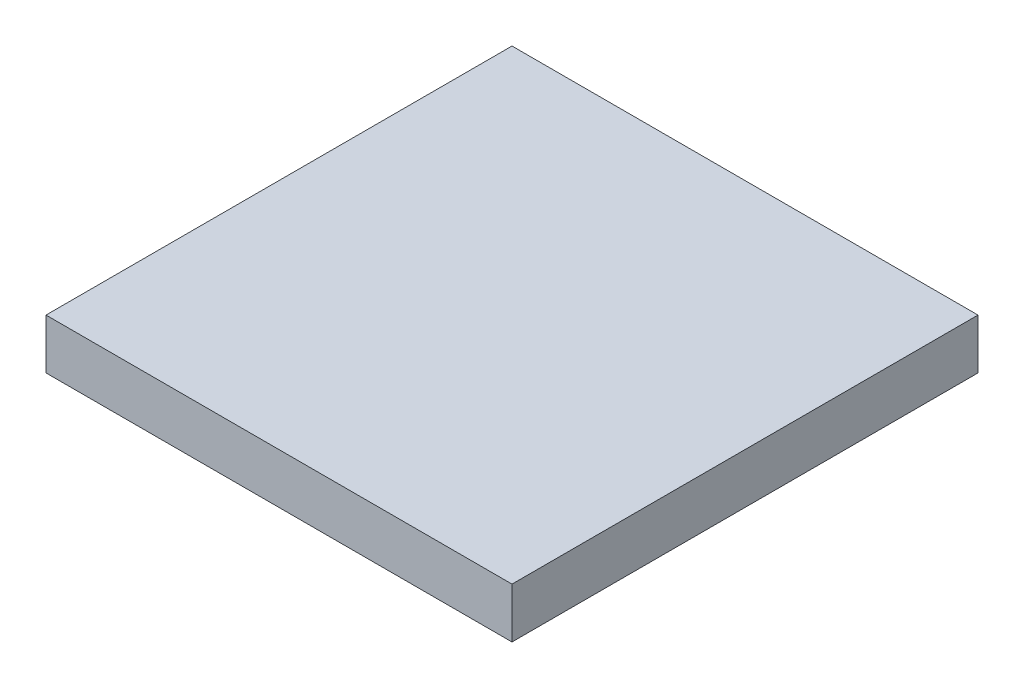
ISO-10303-21;
HEADER;
FILE_DESCRIPTION(('STEP AP214'),'2;1');
FILE_NAME('part.step','',(''),(''),'','','');
FILE_SCHEMA(('AUTOMOTIVE_DESIGN { 1 0 10303 214 1 1 1 1 }'));
ENDSEC;
DATA;
#1=APPLICATION_CONTEXT('core data for automotive mechanical design processes');
#2=APPLICATION_PROTOCOL_DEFINITION('international standard','automotive_design',2000,#1);
#3=PRODUCT_CONTEXT('',#1,'mechanical');
#4=PRODUCT('Part','Part','',(#3));
#5=PRODUCT_RELATED_PRODUCT_CATEGORY('part','',(#4));
#6=PRODUCT_DEFINITION_FORMATION('','',#4);
#7=PRODUCT_DEFINITION_CONTEXT('part definition',#1,'design');
#8=PRODUCT_DEFINITION('design','',#6,#7);
#9=PRODUCT_DEFINITION_SHAPE('','',#8);
#10=(LENGTH_UNIT() NAMED_UNIT(*) SI_UNIT(.MILLI.,.METRE.));
#11=(NAMED_UNIT(*) PLANE_ANGLE_UNIT() SI_UNIT($,.RADIAN.));
#12=(NAMED_UNIT(*) SI_UNIT($,.STERADIAN.) SOLID_ANGLE_UNIT());
#13=UNCERTAINTY_MEASURE_WITH_UNIT(LENGTH_MEASURE(1.E-05),#10,'distance_accuracy_value','');
#14=(GEOMETRIC_REPRESENTATION_CONTEXT(3) GLOBAL_UNCERTAINTY_ASSIGNED_CONTEXT((#13)) GLOBAL_UNIT_ASSIGNED_CONTEXT((#10,
#11,#12)) REPRESENTATION_CONTEXT('',''));
#15=CARTESIAN_POINT('',(0.,0.,0.));
#16=DIRECTION('',(0.,0.,1.));
#17=DIRECTION('',(1.,0.,0.));
#18=AXIS2_PLACEMENT_3D('',#15,#16,#17);
#19=CARTESIAN_POINT('',(0.,0.,0.));
#20=DIRECTION('',(0.,-1.,0.));
#21=DIRECTION('',(0.,0.,-1.));
#22=AXIS2_PLACEMENT_3D('',#19,#20,#21);
#23=PLANE('',#22);
#24=DIRECTION('',(-1.,0.,0.));
#25=VECTOR('',#24,1.);
#26=CARTESIAN_POINT('',(-2.,0.,-8.08041562219304));
#27=LINE('',#26,#25);
#28=CARTESIAN_POINT('',(156.,0.,-8.08041562219304));
#29=VERTEX_POINT('',#28);
#30=CARTESIAN_POINT('',(-2.,0.,-8.08041562219304));
#31=VERTEX_POINT('',#30);
#32=EDGE_CURVE('E156',#29,#31,#27,.T.);
#33=ORIENTED_EDGE('',*,*,#32,.F.);
#34=DIRECTION('',(0.,0.,-1.));
#35=VECTOR('',#34,1.);
#36=CARTESIAN_POINT('',(156.,0.,-8.08041562219304));
#37=LINE('',#36,#35);
#38=CARTESIAN_POINT('',(156.,0.,149.919584377807));
#39=VERTEX_POINT('',#38);
#40=EDGE_CURVE('E57',#39,#29,#37,.T.);
#41=ORIENTED_EDGE('',*,*,#40,.F.);
#42=DIRECTION('',(1.,0.,0.));
#43=VECTOR('',#42,1.);
#44=CARTESIAN_POINT('',(-2.,0.,149.919584377807));
#45=LINE('',#44,#43);
#46=CARTESIAN_POINT('',(-2.,0.,149.919584377807));
#47=VERTEX_POINT('',#46);
#48=EDGE_CURVE('E160',#47,#39,#45,.T.);
#49=ORIENTED_EDGE('',*,*,#48,.F.);
#50=DIRECTION('',(0.,0.,1.));
#51=VECTOR('',#50,1.);
#52=CARTESIAN_POINT('',(-2.,0.,-8.08041562219304));
#53=LINE('',#52,#51);
#54=EDGE_CURVE('E106',#31,#47,#53,.T.);
#55=ORIENTED_EDGE('',*,*,#54,.F.);
#56=EDGE_LOOP('',(#33,#41,#49,#55));
#57=FACE_BOUND('',#56,.T.);
#58=DIRECTION('',(-1.,0.,0.));
#59=VECTOR('',#58,1.);
#60=CARTESIAN_POINT('',(0.,0.,-6.08041562219304));
#61=LINE('',#60,#59);
#62=CARTESIAN_POINT('',(154.,0.,-6.08041562219304));
#63=VERTEX_POINT('',#62);
#64=CARTESIAN_POINT('',(0.,0.,-6.08041562219304));
#65=VERTEX_POINT('',#64);
#66=EDGE_CURVE('E130',#63,#65,#61,.T.);
#67=ORIENTED_EDGE('',*,*,#66,.T.);
#68=DIRECTION('',(0.,0.,1.));
#69=VECTOR('',#68,1.);
#70=CARTESIAN_POINT('',(0.,0.,-6.08041562219304));
#71=LINE('',#70,#69);
#72=CARTESIAN_POINT('',(0.,0.,147.919584377807));
#73=VERTEX_POINT('',#72);
#74=EDGE_CURVE('E49',#65,#73,#71,.T.);
#75=ORIENTED_EDGE('',*,*,#74,.T.);
#76=DIRECTION('',(1.,0.,0.));
#77=VECTOR('',#76,1.);
#78=CARTESIAN_POINT('',(0.,0.,147.919584377807));
#79=LINE('',#78,#77);
#80=CARTESIAN_POINT('',(154.,0.,147.919584377807));
#81=VERTEX_POINT('',#80);
#82=EDGE_CURVE('E141',#73,#81,#79,.T.);
#83=ORIENTED_EDGE('',*,*,#82,.T.);
#84=DIRECTION('',(0.,0.,-1.));
#85=VECTOR('',#84,1.);
#86=CARTESIAN_POINT('',(154.,0.,-6.08041562219304));
#87=LINE('',#86,#85);
#88=EDGE_CURVE('E144',#81,#63,#87,.T.);
#89=ORIENTED_EDGE('',*,*,#88,.T.);
#90=EDGE_LOOP('',(#67,#75,#83,#89));
#91=FACE_BOUND('',#90,.T.);
#92=ADVANCED_FACE('F34',(#57,#91),#23,.T.);
#93=CARTESIAN_POINT('',(-2.,15.,-8.08041562219304));
#94=DIRECTION('',(0.,0.,1.));
#95=DIRECTION('',(1.,0.,0.));
#96=AXIS2_PLACEMENT_3D('',#93,#94,#95);
#97=PLANE('',#96);
#98=ORIENTED_EDGE('',*,*,#32,.T.);
#99=DIRECTION('',(0.,-1.,0.));
#100=VECTOR('',#99,1.);
#101=CARTESIAN_POINT('',(-2.,15.,-8.08041562219304));
#102=LINE('',#101,#100);
#103=CARTESIAN_POINT('',(-2.,17.,-8.08041562219304));
#104=VERTEX_POINT('',#103);
#105=EDGE_CURVE('E11',#104,#31,#102,.T.);
#106=ORIENTED_EDGE('',*,*,#105,.F.);
#107=DIRECTION('',(-1.,0.,0.));
#108=VECTOR('',#107,1.);
#109=CARTESIAN_POINT('',(-2.,17.,-8.08041562219304));
#110=LINE('',#109,#108);
#111=CARTESIAN_POINT('',(156.,17.,-8.08041562219304));
#112=VERTEX_POINT('',#111);
#113=EDGE_CURVE('E121',#112,#104,#110,.T.);
#114=ORIENTED_EDGE('',*,*,#113,.F.);
#115=DIRECTION('',(0.,-1.,0.));
#116=VECTOR('',#115,1.);
#117=CARTESIAN_POINT('',(156.,15.,-8.08041562219304));
#118=LINE('',#117,#116);
#119=EDGE_CURVE('E163',#112,#29,#118,.T.);
#120=ORIENTED_EDGE('',*,*,#119,.T.);
#121=EDGE_LOOP('',(#98,#106,#114,#120));
#122=FACE_BOUND('',#121,.T.);
#123=ADVANCED_FACE('F36',(#122),#97,.F.);
#124=CARTESIAN_POINT('',(-2.,15.,-8.08041562219304));
#125=DIRECTION('',(1.,0.,0.));
#126=DIRECTION('',(0.,0.,-1.));
#127=AXIS2_PLACEMENT_3D('',#124,#125,#126);
#128=PLANE('',#127);
#129=ORIENTED_EDGE('',*,*,#54,.T.);
#130=DIRECTION('',(0.,-1.,0.));
#131=VECTOR('',#130,1.);
#132=CARTESIAN_POINT('',(-2.,15.,149.919584377807));
#133=LINE('',#132,#131);
#134=CARTESIAN_POINT('',(-2.,17.,149.919584377807));
#135=VERTEX_POINT('',#134);
#136=EDGE_CURVE('E42',#135,#47,#133,.T.);
#137=ORIENTED_EDGE('',*,*,#136,.F.);
#138=DIRECTION('',(0.,0.,1.));
#139=VECTOR('',#138,1.);
#140=CARTESIAN_POINT('',(-2.,17.,-8.08041562219304));
#141=LINE('',#140,#139);
#142=EDGE_CURVE('E105',#104,#135,#141,.T.);
#143=ORIENTED_EDGE('',*,*,#142,.F.);
#144=ORIENTED_EDGE('',*,*,#105,.T.);
#145=EDGE_LOOP('',(#129,#137,#143,#144));
#146=FACE_BOUND('',#145,.T.);
#147=ADVANCED_FACE('F103',(#146),#128,.F.);
#148=CARTESIAN_POINT('',(-2.,15.,149.919584377807));
#149=DIRECTION('',(0.,0.,-1.));
#150=DIRECTION('',(-1.,0.,0.));
#151=AXIS2_PLACEMENT_3D('',#148,#149,#150);
#152=PLANE('',#151);
#153=ORIENTED_EDGE('',*,*,#48,.T.);
#154=DIRECTION('',(0.,-1.,0.));
#155=VECTOR('',#154,1.);
#156=CARTESIAN_POINT('',(156.,15.,149.919584377807));
#157=LINE('',#156,#155);
#158=CARTESIAN_POINT('',(156.,17.,149.919584377807));
#159=VERTEX_POINT('',#158);
#160=EDGE_CURVE('E109',#159,#39,#157,.T.);
#161=ORIENTED_EDGE('',*,*,#160,.F.);
#162=DIRECTION('',(1.,0.,0.));
#163=VECTOR('',#162,1.);
#164=CARTESIAN_POINT('',(-2.,17.,149.919584377807));
#165=LINE('',#164,#163);
#166=EDGE_CURVE('E111',#135,#159,#165,.T.);
#167=ORIENTED_EDGE('',*,*,#166,.F.);
#168=ORIENTED_EDGE('',*,*,#136,.T.);
#169=EDGE_LOOP('',(#153,#161,#167,#168));
#170=FACE_BOUND('',#169,.T.);
#171=ADVANCED_FACE('F112',(#170),#152,.F.);
#172=CARTESIAN_POINT('',(156.,15.,-8.08041562219304));
#173=DIRECTION('',(-1.,0.,0.));
#174=DIRECTION('',(0.,0.,1.));
#175=AXIS2_PLACEMENT_3D('',#172,#173,#174);
#176=PLANE('',#175);
#177=ORIENTED_EDGE('',*,*,#40,.T.);
#178=ORIENTED_EDGE('',*,*,#119,.F.);
#179=DIRECTION('',(0.,0.,-1.));
#180=VECTOR('',#179,1.);
#181=CARTESIAN_POINT('',(156.,17.,-8.08041562219304));
#182=LINE('',#181,#180);
#183=EDGE_CURVE('E116',#159,#112,#182,.T.);
#184=ORIENTED_EDGE('',*,*,#183,.F.);
#185=ORIENTED_EDGE('',*,*,#160,.T.);
#186=EDGE_LOOP('',(#177,#178,#184,#185));
#187=FACE_BOUND('',#186,.T.);
#188=ADVANCED_FACE('F165',(#187),#176,.F.);
#189=CARTESIAN_POINT('',(0.,15.,-6.08041562219304));
#190=DIRECTION('',(1.,0.,0.));
#191=DIRECTION('',(0.,0.,-1.));
#192=AXIS2_PLACEMENT_3D('',#189,#190,#191);
#193=PLANE('',#192);
#194=ORIENTED_EDGE('',*,*,#74,.F.);
#195=DIRECTION('',(0.,-1.,0.));
#196=VECTOR('',#195,1.);
#197=CARTESIAN_POINT('',(0.,15.,-6.08041562219304));
#198=LINE('',#197,#196);
#199=CARTESIAN_POINT('',(0.,15.,-6.08041562219304));
#200=VERTEX_POINT('',#199);
#201=EDGE_CURVE('E139',#200,#65,#198,.T.);
#202=ORIENTED_EDGE('',*,*,#201,.F.);
#203=DIRECTION('',(0.,0.,1.));
#204=VECTOR('',#203,1.);
#205=CARTESIAN_POINT('',(0.,15.,-6.08041562219304));
#206=LINE('',#205,#204);
#207=CARTESIAN_POINT('',(0.,15.,147.919584377807));
#208=VERTEX_POINT('',#207);
#209=EDGE_CURVE('E126',#200,#208,#206,.T.);
#210=ORIENTED_EDGE('',*,*,#209,.T.);
#211=DIRECTION('',(0.,-1.,0.));
#212=VECTOR('',#211,1.);
#213=CARTESIAN_POINT('',(0.,15.,147.919584377807));
#214=LINE('',#213,#212);
#215=EDGE_CURVE('E154',#208,#73,#214,.T.);
#216=ORIENTED_EDGE('',*,*,#215,.T.);
#217=EDGE_LOOP('',(#194,#202,#210,#216));
#218=FACE_BOUND('',#217,.T.);
#219=ADVANCED_FACE('F180',(#218),#193,.T.);
#220=CARTESIAN_POINT('',(0.,15.,147.919584377807));
#221=DIRECTION('',(0.,0.,-1.));
#222=DIRECTION('',(-1.,0.,0.));
#223=AXIS2_PLACEMENT_3D('',#220,#221,#222);
#224=PLANE('',#223);
#225=ORIENTED_EDGE('',*,*,#82,.F.);
#226=ORIENTED_EDGE('',*,*,#215,.F.);
#227=DIRECTION('',(1.,0.,0.));
#228=VECTOR('',#227,1.);
#229=CARTESIAN_POINT('',(0.,15.,147.919584377807));
#230=LINE('',#229,#228);
#231=CARTESIAN_POINT('',(154.,15.,147.919584377807));
#232=VERTEX_POINT('',#231);
#233=EDGE_CURVE('E129',#208,#232,#230,.T.);
#234=ORIENTED_EDGE('',*,*,#233,.T.);
#235=DIRECTION('',(0.,-1.,0.));
#236=VECTOR('',#235,1.);
#237=CARTESIAN_POINT('',(154.,15.,147.919584377807));
#238=LINE('',#237,#236);
#239=EDGE_CURVE('E152',#232,#81,#238,.T.);
#240=ORIENTED_EDGE('',*,*,#239,.T.);
#241=EDGE_LOOP('',(#225,#226,#234,#240));
#242=FACE_BOUND('',#241,.T.);
#243=ADVANCED_FACE('F199',(#242),#224,.T.);
#244=CARTESIAN_POINT('',(154.,15.,-6.08041562219304));
#245=DIRECTION('',(-1.,0.,0.));
#246=DIRECTION('',(0.,0.,1.));
#247=AXIS2_PLACEMENT_3D('',#244,#245,#246);
#248=PLANE('',#247);
#249=ORIENTED_EDGE('',*,*,#88,.F.);
#250=ORIENTED_EDGE('',*,*,#239,.F.);
#251=DIRECTION('',(0.,0.,-1.));
#252=VECTOR('',#251,1.);
#253=CARTESIAN_POINT('',(154.,15.,-6.08041562219304));
#254=LINE('',#253,#252);
#255=CARTESIAN_POINT('',(154.,15.,-6.08041562219304));
#256=VERTEX_POINT('',#255);
#257=EDGE_CURVE('E133',#232,#256,#254,.T.);
#258=ORIENTED_EDGE('',*,*,#257,.T.);
#259=DIRECTION('',(0.,-1.,0.));
#260=VECTOR('',#259,1.);
#261=CARTESIAN_POINT('',(154.,15.,-6.08041562219304));
#262=LINE('',#261,#260);
#263=EDGE_CURVE('E150',#256,#63,#262,.T.);
#264=ORIENTED_EDGE('',*,*,#263,.T.);
#265=EDGE_LOOP('',(#249,#250,#258,#264));
#266=FACE_BOUND('',#265,.T.);
#267=ADVANCED_FACE('F205',(#266),#248,.T.);
#268=CARTESIAN_POINT('',(0.,15.,-6.08041562219304));
#269=DIRECTION('',(0.,0.,1.));
#270=DIRECTION('',(1.,0.,0.));
#271=AXIS2_PLACEMENT_3D('',#268,#269,#270);
#272=PLANE('',#271);
#273=ORIENTED_EDGE('',*,*,#66,.F.);
#274=ORIENTED_EDGE('',*,*,#263,.F.);
#275=DIRECTION('',(-1.,0.,0.));
#276=VECTOR('',#275,1.);
#277=CARTESIAN_POINT('',(0.,15.,-6.08041562219304));
#278=LINE('',#277,#276);
#279=EDGE_CURVE('E136',#256,#200,#278,.T.);
#280=ORIENTED_EDGE('',*,*,#279,.T.);
#281=ORIENTED_EDGE('',*,*,#201,.T.);
#282=EDGE_LOOP('',(#273,#274,#280,#281));
#283=FACE_BOUND('',#282,.T.);
#284=ADVANCED_FACE('F212',(#283),#272,.T.);
#285=CARTESIAN_POINT('',(0.,15.,0.));
#286=DIRECTION('',(0.,1.,0.));
#287=DIRECTION('',(0.,0.,1.));
#288=AXIS2_PLACEMENT_3D('',#285,#286,#287);
#289=PLANE('',#288);
#290=ORIENTED_EDGE('',*,*,#209,.F.);
#291=ORIENTED_EDGE('',*,*,#279,.F.);
#292=ORIENTED_EDGE('',*,*,#257,.F.);
#293=ORIENTED_EDGE('',*,*,#233,.F.);
#294=EDGE_LOOP('',(#290,#291,#292,#293));
#295=FACE_BOUND('',#294,.T.);
#296=ADVANCED_FACE('F220',(#295),#289,.F.);
#297=CARTESIAN_POINT('',(0.,17.,0.));
#298=DIRECTION('',(0.,1.,0.));
#299=DIRECTION('',(0.,0.,1.));
#300=AXIS2_PLACEMENT_3D('',#297,#298,#299);
#301=PLANE('',#300);
#302=ORIENTED_EDGE('',*,*,#142,.T.);
#303=ORIENTED_EDGE('',*,*,#166,.T.);
#304=ORIENTED_EDGE('',*,*,#183,.T.);
#305=ORIENTED_EDGE('',*,*,#113,.T.);
#306=EDGE_LOOP('',(#302,#303,#304,#305));
#307=FACE_BOUND('',#306,.T.);
#308=ADVANCED_FACE('F119',(#307),#301,.T.);
#309=CLOSED_SHELL('',(#92,#123,#147,#171,#188,#219,#243,#267,#284,#296,#308));
#310=MANIFOLD_SOLID_BREP('B2',#309);
#311=ADVANCED_BREP_SHAPE_REPRESENTATION('',(#18,#310),#14);
#312=SHAPE_DEFINITION_REPRESENTATION(#9,#311);
ENDSEC;
END-ISO-10303-21;
